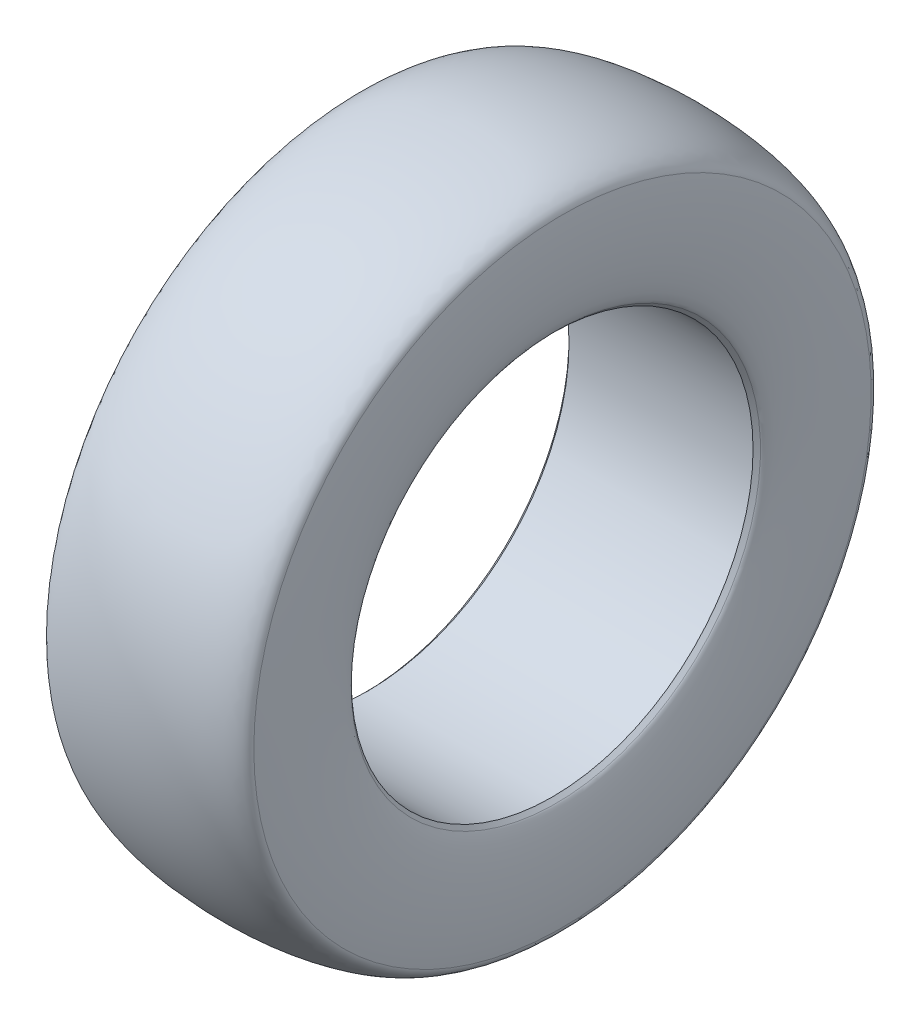
ISO-10303-21;
HEADER;
FILE_DESCRIPTION(('STEP AP214'),'2;1');
FILE_NAME('part.step','',(''),(''),'','','');
FILE_SCHEMA(('AUTOMOTIVE_DESIGN { 1 0 10303 214 1 1 1 1 }'));
ENDSEC;
DATA;
#1=APPLICATION_CONTEXT('core data for automotive mechanical design processes');
#2=APPLICATION_PROTOCOL_DEFINITION('international standard','automotive_design',2000,#1);
#3=PRODUCT_CONTEXT('',#1,'mechanical');
#4=PRODUCT('Part','Part','',(#3));
#5=PRODUCT_RELATED_PRODUCT_CATEGORY('part','',(#4));
#6=PRODUCT_DEFINITION_FORMATION('','',#4);
#7=PRODUCT_DEFINITION_CONTEXT('part definition',#1,'design');
#8=PRODUCT_DEFINITION('design','',#6,#7);
#9=PRODUCT_DEFINITION_SHAPE('','',#8);
#10=(LENGTH_UNIT() NAMED_UNIT(*) SI_UNIT(.MILLI.,.METRE.));
#11=(NAMED_UNIT(*) PLANE_ANGLE_UNIT() SI_UNIT($,.RADIAN.));
#12=(NAMED_UNIT(*) SI_UNIT($,.STERADIAN.) SOLID_ANGLE_UNIT());
#13=UNCERTAINTY_MEASURE_WITH_UNIT(LENGTH_MEASURE(1.E-05),#10,'distance_accuracy_value','');
#14=(GEOMETRIC_REPRESENTATION_CONTEXT(3) GLOBAL_UNCERTAINTY_ASSIGNED_CONTEXT((#13)) GLOBAL_UNIT_ASSIGNED_CONTEXT((#10,
#11,#12)) REPRESENTATION_CONTEXT('',''));
#15=CARTESIAN_POINT('',(0.,0.,0.));
#16=DIRECTION('',(0.,0.,1.));
#17=DIRECTION('',(1.,0.,0.));
#18=AXIS2_PLACEMENT_3D('',#15,#16,#17);
#19=CARTESIAN_POINT('',(-114.056846686133,325.886259272776,0.));
#20=DIRECTION('',(0.,0.,1.));
#21=DIRECTION('',(0.,-1.,0.));
#22=AXIS2_PLACEMENT_3D('',#19,#20,#21);
#23=ELLIPSE('',#22,78.6006106280388,12.943153313867);
#24=CARTESIAN_POINT('',(-1000.,0.,0.));
#25=DIRECTION('',(-1.,0.,0.));
#26=AXIS1_PLACEMENT('',#24,#25);
#27=SURFACE_OF_REVOLUTION('',#23,#26);
#28=CARTESIAN_POINT('',(-116.159871939465,0.,0.));
#29=DIRECTION('',(-1.,0.,0.));
#30=DIRECTION('',(0.,0.,1.));
#31=AXIS2_PLACEMENT_3D('',#28,#29,#30);
#32=CIRCLE('',#31,248.330128060535);
#33=CARTESIAN_POINT('',(-116.159871939465,0.,248.330128060535));
#34=VERTEX_POINT('',#33);
#35=EDGE_CURVE('E10',#34,#34,#32,.T.);
#36=ORIENTED_EDGE('',*,*,#35,.F.);
#37=EDGE_LOOP('',(#36));
#38=FACE_BOUND('',#37,.T.);
#39=CARTESIAN_POINT('',(-124.21699820195,0.,0.));
#40=DIRECTION('',(-1.,0.,0.));
#41=DIRECTION('',(0.,0.,1.));
#42=AXIS2_PLACEMENT_3D('',#39,#40,#41);
#43=CIRCLE('',#42,374.580726901316);
#44=CARTESIAN_POINT('',(-124.21699820195,0.,374.580726901316));
#45=VERTEX_POINT('',#44);
#46=EDGE_CURVE('E57',#45,#45,#43,.T.);
#47=ORIENTED_EDGE('',*,*,#46,.T.);
#48=EDGE_LOOP('',(#47));
#49=FACE_BOUND('',#48,.T.);
#50=ADVANCED_FACE('F34',(#38,#49),#27,.T.);
#51=CARTESIAN_POINT('',(-116.159871939465,0.,0.));
#52=DIRECTION('',(-1.,0.,0.));
#53=DIRECTION('',(0.,0.,1.));
#54=AXIS2_PLACEMENT_3D('',#51,#52,#53);
#55=CONICAL_SURFACE('',#54,248.330128060535,0.785398163397445);
#56=CARTESIAN_POINT('',(-111.669743878931,0.,0.));
#57=DIRECTION('',(-1.,0.,0.));
#58=DIRECTION('',(0.,0.,1.));
#59=AXIS2_PLACEMENT_3D('',#56,#57,#58);
#60=CIRCLE('',#59,243.84);
#61=CARTESIAN_POINT('',(-111.669743878931,0.,243.84));
#62=VERTEX_POINT('',#61);
#63=EDGE_CURVE('E41',#62,#62,#60,.T.);
#64=ORIENTED_EDGE('',*,*,#63,.F.);
#65=EDGE_LOOP('',(#64));
#66=FACE_BOUND('',#65,.T.);
#67=ORIENTED_EDGE('',*,*,#35,.T.);
#68=EDGE_LOOP('',(#67));
#69=FACE_BOUND('',#68,.T.);
#70=ADVANCED_FACE('F77',(#66,#69),#55,.F.);
#71=CARTESIAN_POINT('',(-1000.,0.,0.));
#72=DIRECTION('',(-1.,0.,0.));
#73=DIRECTION('',(0.,0.,1.));
#74=AXIS2_PLACEMENT_3D('',#71,#72,#73);
#75=CYLINDRICAL_SURFACE('',#74,243.84);
#76=CARTESIAN_POINT('',(111.669743878931,0.,0.));
#77=DIRECTION('',(-1.,0.,0.));
#78=DIRECTION('',(0.,0.,1.));
#79=AXIS2_PLACEMENT_3D('',#76,#77,#78);
#80=CIRCLE('',#79,243.84);
#81=CARTESIAN_POINT('',(111.669743878931,0.,243.84));
#82=VERTEX_POINT('',#81);
#83=EDGE_CURVE('E45',#82,#82,#80,.T.);
#84=ORIENTED_EDGE('',*,*,#83,.F.);
#85=EDGE_LOOP('',(#84));
#86=FACE_BOUND('',#85,.T.);
#87=ORIENTED_EDGE('',*,*,#63,.T.);
#88=EDGE_LOOP('',(#87));
#89=FACE_BOUND('',#88,.T.);
#90=ADVANCED_FACE('F74',(#86,#89),#75,.F.);
#91=CARTESIAN_POINT('',(111.669743878931,0.,0.));
#92=DIRECTION('',(1.,0.,0.));
#93=DIRECTION('',(0.,0.,-1.));
#94=AXIS2_PLACEMENT_3D('',#91,#92,#93);
#95=CONICAL_SURFACE('',#94,243.84,0.785398163397458);
#96=CARTESIAN_POINT('',(116.159871939465,0.,0.));
#97=DIRECTION('',(-1.,0.,0.));
#98=DIRECTION('',(0.,0.,1.));
#99=AXIS2_PLACEMENT_3D('',#96,#97,#98);
#100=CIRCLE('',#99,248.330128060535);
#101=CARTESIAN_POINT('',(116.159871939465,0.,248.330128060535));
#102=VERTEX_POINT('',#101);
#103=EDGE_CURVE('E49',#102,#102,#100,.T.);
#104=ORIENTED_EDGE('',*,*,#103,.F.);
#105=EDGE_LOOP('',(#104));
#106=FACE_BOUND('',#105,.T.);
#107=ORIENTED_EDGE('',*,*,#83,.T.);
#108=EDGE_LOOP('',(#107));
#109=FACE_BOUND('',#108,.T.);
#110=ADVANCED_FACE('F70',(#106,#109),#95,.F.);
#111=CARTESIAN_POINT('',(114.056846686133,325.886259272776,0.));
#112=DIRECTION('',(0.,0.,1.));
#113=DIRECTION('',(0.,-1.,0.));
#114=AXIS2_PLACEMENT_3D('',#111,#112,#113);
#115=ELLIPSE('',#114,78.6006106280388,12.943153313867);
#116=CARTESIAN_POINT('',(-1000.,0.,0.));
#117=DIRECTION('',(-1.,0.,0.));
#118=AXIS1_PLACEMENT('',#116,#117);
#119=SURFACE_OF_REVOLUTION('',#115,#118);
#120=CARTESIAN_POINT('',(124.21699820195,0.,0.));
#121=DIRECTION('',(-1.,0.,0.));
#122=DIRECTION('',(0.,0.,1.));
#123=AXIS2_PLACEMENT_3D('',#120,#121,#122);
#124=CIRCLE('',#123,374.580726901316);
#125=CARTESIAN_POINT('',(124.21699820195,0.,374.580726901316));
#126=VERTEX_POINT('',#125);
#127=EDGE_CURVE('E54',#126,#126,#124,.T.);
#128=ORIENTED_EDGE('',*,*,#127,.F.);
#129=EDGE_LOOP('',(#128));
#130=FACE_BOUND('',#129,.T.);
#131=ORIENTED_EDGE('',*,*,#103,.T.);
#132=EDGE_LOOP('',(#131));
#133=FACE_BOUND('',#132,.T.);
#134=ADVANCED_FACE('F66',(#130,#133),#119,.T.);
#135=CARTESIAN_POINT('',(0.,373.445897982817,0.));
#136=DIRECTION('',(0.,0.,1.));
#137=DIRECTION('',(-1.,0.,0.));
#138=AXIS2_PLACEMENT_3D('',#135,#136,#137);
#139=ELLIPSE('',#138,124.290717185098,32.9541020171825);
#140=CARTESIAN_POINT('',(-1000.,0.,0.));
#141=DIRECTION('',(-1.,0.,0.));
#142=AXIS1_PLACEMENT('',#140,#141);
#143=SURFACE_OF_REVOLUTION('',#139,#142);
#144=ORIENTED_EDGE('',*,*,#46,.F.);
#145=EDGE_LOOP('',(#144));
#146=FACE_BOUND('',#145,.T.);
#147=ORIENTED_EDGE('',*,*,#127,.T.);
#148=EDGE_LOOP('',(#147));
#149=FACE_BOUND('',#148,.T.);
#150=ADVANCED_FACE('F64',(#146,#149),#143,.T.);
#151=CLOSED_SHELL('',(#50,#70,#90,#110,#134,#150));
#152=MANIFOLD_SOLID_BREP('B2',#151);
#153=ADVANCED_BREP_SHAPE_REPRESENTATION('',(#18,#152),#14);
#154=SHAPE_DEFINITION_REPRESENTATION(#9,#153);
ENDSEC;
END-ISO-10303-21;
